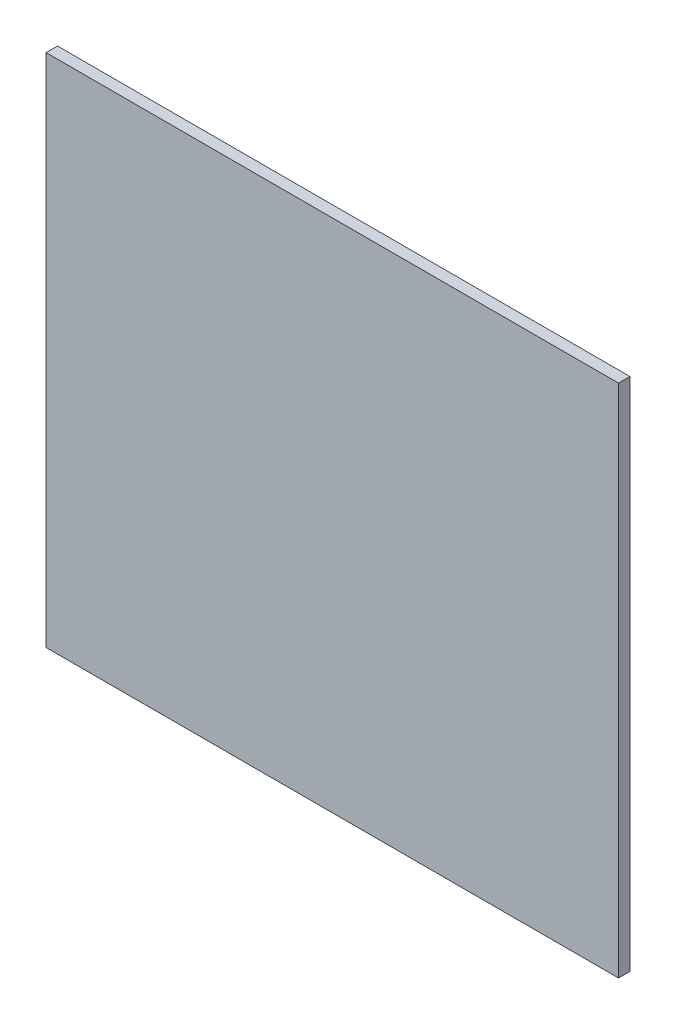
ISO-10303-21;
HEADER;
FILE_DESCRIPTION(('STEP AP214'),'2;1');
FILE_NAME('part.step','',(''),(''),'','','');
FILE_SCHEMA(('AUTOMOTIVE_DESIGN { 1 0 10303 214 1 1 1 1 }'));
ENDSEC;
DATA;
#1=APPLICATION_CONTEXT('core data for automotive mechanical design processes');
#2=APPLICATION_PROTOCOL_DEFINITION('international standard','automotive_design',2000,#1);
#3=PRODUCT_CONTEXT('',#1,'mechanical');
#4=PRODUCT('Part','Part','',(#3));
#5=PRODUCT_RELATED_PRODUCT_CATEGORY('part','',(#4));
#6=PRODUCT_DEFINITION_FORMATION('','',#4);
#7=PRODUCT_DEFINITION_CONTEXT('part definition',#1,'design');
#8=PRODUCT_DEFINITION('design','',#6,#7);
#9=PRODUCT_DEFINITION_SHAPE('','',#8);
#10=(LENGTH_UNIT() NAMED_UNIT(*) SI_UNIT(.MILLI.,.METRE.));
#11=(NAMED_UNIT(*) PLANE_ANGLE_UNIT() SI_UNIT($,.RADIAN.));
#12=(NAMED_UNIT(*) SI_UNIT($,.STERADIAN.) SOLID_ANGLE_UNIT());
#13=UNCERTAINTY_MEASURE_WITH_UNIT(LENGTH_MEASURE(1.E-05),#10,'distance_accuracy_value','');
#14=(GEOMETRIC_REPRESENTATION_CONTEXT(3) GLOBAL_UNCERTAINTY_ASSIGNED_CONTEXT((#13)) GLOBAL_UNIT_ASSIGNED_CONTEXT((#10,
#11,#12)) REPRESENTATION_CONTEXT('',''));
#15=CARTESIAN_POINT('',(0.,0.,0.));
#16=DIRECTION('',(0.,0.,1.));
#17=DIRECTION('',(1.,0.,0.));
#18=AXIS2_PLACEMENT_3D('',#15,#16,#17);
#19=CARTESIAN_POINT('',(100.,-90.,4.));
#20=DIRECTION('',(-1.,0.,0.));
#21=DIRECTION('',(0.,0.,1.));
#22=AXIS2_PLACEMENT_3D('',#19,#20,#21);
#23=PLANE('',#22);
#24=DIRECTION('',(0.,1.,0.));
#25=VECTOR('',#24,1.);
#26=CARTESIAN_POINT('',(100.,-90.,0.));
#27=LINE('',#26,#25);
#28=CARTESIAN_POINT('',(100.,-90.,0.));
#29=VERTEX_POINT('',#28);
#30=CARTESIAN_POINT('',(100.,90.,0.));
#31=VERTEX_POINT('',#30);
#32=EDGE_CURVE('E98',#29,#31,#27,.T.);
#33=ORIENTED_EDGE('',*,*,#32,.T.);
#34=DIRECTION('',(0.,0.,-1.));
#35=VECTOR('',#34,1.);
#36=CARTESIAN_POINT('',(100.,90.,4.));
#37=LINE('',#36,#35);
#38=CARTESIAN_POINT('',(100.,90.,4.));
#39=VERTEX_POINT('',#38);
#40=EDGE_CURVE('E11',#39,#31,#37,.T.);
#41=ORIENTED_EDGE('',*,*,#40,.F.);
#42=DIRECTION('',(0.,1.,0.));
#43=VECTOR('',#42,1.);
#44=CARTESIAN_POINT('',(100.,-90.,4.));
#45=LINE('',#44,#43);
#46=CARTESIAN_POINT('',(100.,-90.,4.));
#47=VERTEX_POINT('',#46);
#48=EDGE_CURVE('E86',#47,#39,#45,.T.);
#49=ORIENTED_EDGE('',*,*,#48,.F.);
#50=DIRECTION('',(0.,0.,-1.));
#51=VECTOR('',#50,1.);
#52=CARTESIAN_POINT('',(100.,-90.,4.));
#53=LINE('',#52,#51);
#54=EDGE_CURVE('E94',#47,#29,#53,.T.);
#55=ORIENTED_EDGE('',*,*,#54,.T.);
#56=EDGE_LOOP('',(#33,#41,#49,#55));
#57=FACE_BOUND('',#56,.T.);
#58=ADVANCED_FACE('F35',(#57),#23,.F.);
#59=CARTESIAN_POINT('',(-100.,90.,4.));
#60=DIRECTION('',(0.,-1.,0.));
#61=DIRECTION('',(0.,0.,-1.));
#62=AXIS2_PLACEMENT_3D('',#59,#60,#61);
#63=PLANE('',#62);
#64=DIRECTION('',(-1.,0.,0.));
#65=VECTOR('',#64,1.);
#66=CARTESIAN_POINT('',(-100.,90.,0.));
#67=LINE('',#66,#65);
#68=CARTESIAN_POINT('',(-100.,90.,0.));
#69=VERTEX_POINT('',#68);
#70=EDGE_CURVE('E90',#31,#69,#67,.T.);
#71=ORIENTED_EDGE('',*,*,#70,.T.);
#72=DIRECTION('',(0.,0.,-1.));
#73=VECTOR('',#72,1.);
#74=CARTESIAN_POINT('',(-100.,90.,4.));
#75=LINE('',#74,#73);
#76=CARTESIAN_POINT('',(-100.,90.,4.));
#77=VERTEX_POINT('',#76);
#78=EDGE_CURVE('E43',#77,#69,#75,.T.);
#79=ORIENTED_EDGE('',*,*,#78,.F.);
#80=DIRECTION('',(-1.,0.,0.));
#81=VECTOR('',#80,1.);
#82=CARTESIAN_POINT('',(-100.,90.,4.));
#83=LINE('',#82,#81);
#84=EDGE_CURVE('E81',#39,#77,#83,.T.);
#85=ORIENTED_EDGE('',*,*,#84,.F.);
#86=ORIENTED_EDGE('',*,*,#40,.T.);
#87=EDGE_LOOP('',(#71,#79,#85,#86));
#88=FACE_BOUND('',#87,.T.);
#89=ADVANCED_FACE('F89',(#88),#63,.F.);
#90=CARTESIAN_POINT('',(-100.,-90.,4.));
#91=DIRECTION('',(1.,0.,0.));
#92=DIRECTION('',(0.,0.,-1.));
#93=AXIS2_PLACEMENT_3D('',#90,#91,#92);
#94=PLANE('',#93);
#95=DIRECTION('',(0.,-1.,0.));
#96=VECTOR('',#95,1.);
#97=CARTESIAN_POINT('',(-100.,-90.,0.));
#98=LINE('',#97,#96);
#99=CARTESIAN_POINT('',(-100.,-90.,0.));
#100=VERTEX_POINT('',#99);
#101=EDGE_CURVE('E68',#69,#100,#98,.T.);
#102=ORIENTED_EDGE('',*,*,#101,.T.);
#103=DIRECTION('',(0.,0.,-1.));
#104=VECTOR('',#103,1.);
#105=CARTESIAN_POINT('',(-100.,-90.,4.));
#106=LINE('',#105,#104);
#107=CARTESIAN_POINT('',(-100.,-90.,4.));
#108=VERTEX_POINT('',#107);
#109=EDGE_CURVE('E91',#108,#100,#106,.T.);
#110=ORIENTED_EDGE('',*,*,#109,.F.);
#111=DIRECTION('',(0.,-1.,0.));
#112=VECTOR('',#111,1.);
#113=CARTESIAN_POINT('',(-100.,-90.,4.));
#114=LINE('',#113,#112);
#115=EDGE_CURVE('E84',#77,#108,#114,.T.);
#116=ORIENTED_EDGE('',*,*,#115,.F.);
#117=ORIENTED_EDGE('',*,*,#78,.T.);
#118=EDGE_LOOP('',(#102,#110,#116,#117));
#119=FACE_BOUND('',#118,.T.);
#120=ADVANCED_FACE('F92',(#119),#94,.F.);
#121=CARTESIAN_POINT('',(-100.,-90.,4.));
#122=DIRECTION('',(0.,1.,0.));
#123=DIRECTION('',(0.,0.,1.));
#124=AXIS2_PLACEMENT_3D('',#121,#122,#123);
#125=PLANE('',#124);
#126=DIRECTION('',(1.,0.,0.));
#127=VECTOR('',#126,1.);
#128=CARTESIAN_POINT('',(-100.,-90.,0.));
#129=LINE('',#128,#127);
#130=EDGE_CURVE('E74',#100,#29,#129,.T.);
#131=ORIENTED_EDGE('',*,*,#130,.T.);
#132=ORIENTED_EDGE('',*,*,#54,.F.);
#133=DIRECTION('',(1.,0.,0.));
#134=VECTOR('',#133,1.);
#135=CARTESIAN_POINT('',(-100.,-90.,4.));
#136=LINE('',#135,#134);
#137=EDGE_CURVE('E51',#108,#47,#136,.T.);
#138=ORIENTED_EDGE('',*,*,#137,.F.);
#139=ORIENTED_EDGE('',*,*,#109,.T.);
#140=EDGE_LOOP('',(#131,#132,#138,#139));
#141=FACE_BOUND('',#140,.T.);
#142=ADVANCED_FACE('F105',(#141),#125,.F.);
#143=CARTESIAN_POINT('',(0.,0.,4.));
#144=DIRECTION('',(0.,0.,-1.));
#145=DIRECTION('',(-1.,0.,0.));
#146=AXIS2_PLACEMENT_3D('',#143,#144,#145);
#147=PLANE('',#146);
#148=ORIENTED_EDGE('',*,*,#48,.T.);
#149=ORIENTED_EDGE('',*,*,#84,.T.);
#150=ORIENTED_EDGE('',*,*,#115,.T.);
#151=ORIENTED_EDGE('',*,*,#137,.T.);
#152=EDGE_LOOP('',(#148,#149,#150,#151));
#153=FACE_BOUND('',#152,.T.);
#154=ADVANCED_FACE('F82',(#153),#147,.F.);
#155=CARTESIAN_POINT('',(0.,0.,0.));
#156=DIRECTION('',(0.,0.,-1.));
#157=DIRECTION('',(-1.,0.,0.));
#158=AXIS2_PLACEMENT_3D('',#155,#156,#157);
#159=PLANE('',#158);
#160=ORIENTED_EDGE('',*,*,#32,.F.);
#161=ORIENTED_EDGE('',*,*,#130,.F.);
#162=ORIENTED_EDGE('',*,*,#101,.F.);
#163=ORIENTED_EDGE('',*,*,#70,.F.);
#164=EDGE_LOOP('',(#160,#161,#162,#163));
#165=FACE_BOUND('',#164,.T.);
#166=ADVANCED_FACE('F108',(#165),#159,.T.);
#167=CLOSED_SHELL('',(#58,#89,#120,#142,#154,#166));
#168=MANIFOLD_SOLID_BREP('B2',#167);
#169=ADVANCED_BREP_SHAPE_REPRESENTATION('',(#18,#168),#14);
#170=SHAPE_DEFINITION_REPRESENTATION(#9,#169);
ENDSEC;
END-ISO-10303-21;
